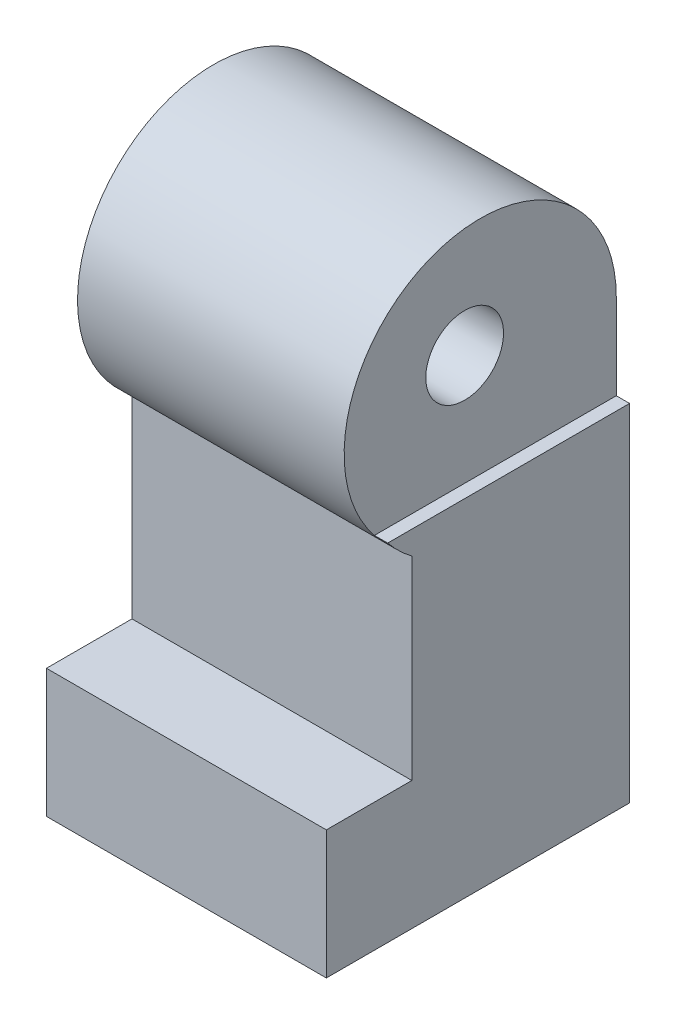
ISO-10303-21;
HEADER;
FILE_DESCRIPTION(('STEP AP214'),'2;1');
FILE_NAME('part.step','',(''),(''),'','','');
FILE_SCHEMA(('AUTOMOTIVE_DESIGN { 1 0 10303 214 1 1 1 1 }'));
ENDSEC;
DATA;
#1=APPLICATION_CONTEXT('core data for automotive mechanical design processes');
#2=APPLICATION_PROTOCOL_DEFINITION('international standard','automotive_design',2000,#1);
#3=PRODUCT_CONTEXT('',#1,'mechanical');
#4=PRODUCT('Part','Part','',(#3));
#5=PRODUCT_RELATED_PRODUCT_CATEGORY('part','',(#4));
#6=PRODUCT_DEFINITION_FORMATION('','',#4);
#7=PRODUCT_DEFINITION_CONTEXT('part definition',#1,'design');
#8=PRODUCT_DEFINITION('design','',#6,#7);
#9=PRODUCT_DEFINITION_SHAPE('','',#8);
#10=(LENGTH_UNIT() NAMED_UNIT(*) SI_UNIT(.MILLI.,.METRE.));
#11=(NAMED_UNIT(*) PLANE_ANGLE_UNIT() SI_UNIT($,.RADIAN.));
#12=(NAMED_UNIT(*) SI_UNIT($,.STERADIAN.) SOLID_ANGLE_UNIT());
#13=UNCERTAINTY_MEASURE_WITH_UNIT(LENGTH_MEASURE(1.E-05),#10,'distance_accuracy_value','');
#14=(GEOMETRIC_REPRESENTATION_CONTEXT(3) GLOBAL_UNCERTAINTY_ASSIGNED_CONTEXT((#13)) GLOBAL_UNIT_ASSIGNED_CONTEXT((#10,
#11,#12)) REPRESENTATION_CONTEXT('',''));
#15=CARTESIAN_POINT('',(0.,0.,0.));
#16=DIRECTION('',(0.,0.,1.));
#17=DIRECTION('',(1.,0.,0.));
#18=AXIS2_PLACEMENT_3D('',#15,#16,#17);
#19=CARTESIAN_POINT('',(10.8,11.4,-1.19999999999999));
#20=DIRECTION('',(-1.,0.,0.));
#21=DIRECTION('',(0.,0.,1.));
#22=AXIS2_PLACEMENT_3D('',#19,#20,#21);
#23=CYLINDRICAL_SURFACE('',#22,10.5);
#24=CARTESIAN_POINT('',(10.8,11.4,-1.19999999999999));
#25=DIRECTION('',(1.,0.,0.));
#26=DIRECTION('',(0.,0.,-1.));
#27=AXIS2_PLACEMENT_3D('',#24,#25,#26);
#28=CIRCLE('',#27,10.5);
#29=CARTESIAN_POINT('',(10.8,4.8,6.96639455328973));
#30=VERTEX_POINT('',#29);
#31=CARTESIAN_POINT('',(10.8,3.,5.10000000000001));
#32=VERTEX_POINT('',#31);
#33=EDGE_CURVE('E105',#30,#32,#28,.T.);
#34=ORIENTED_EDGE('',*,*,#33,.F.);
#35=DIRECTION('',(-1.,0.,0.));
#36=VECTOR('',#35,1.);
#37=CARTESIAN_POINT('',(10.8,4.8,6.96639455328972));
#38=LINE('',#37,#36);
#39=CARTESIAN_POINT('',(9.775,4.8,6.96639455328973));
#40=VERTEX_POINT('',#39);
#41=EDGE_CURVE('E61',#30,#40,#38,.T.);
#42=ORIENTED_EDGE('',*,*,#41,.T.);
#43=CARTESIAN_POINT('',(9.775,11.4,-1.19999999999999));
#44=DIRECTION('',(-1.,0.,0.));
#45=DIRECTION('',(0.,-1.,0.));
#46=AXIS2_PLACEMENT_3D('',#43,#44,#45);
#47=CIRCLE('',#46,10.5);
#48=CARTESIAN_POINT('',(9.775,11.4,-11.7));
#49=VERTEX_POINT('',#48);
#50=EDGE_CURVE('E149',#40,#49,#47,.T.);
#51=ORIENTED_EDGE('',*,*,#50,.T.);
#52=DIRECTION('',(-1.,0.,0.));
#53=VECTOR('',#52,1.);
#54=CARTESIAN_POINT('',(10.8,11.4,-11.7));
#55=LINE('',#54,#53);
#56=CARTESIAN_POINT('',(-10.8,11.4,-11.7));
#57=VERTEX_POINT('',#56);
#58=EDGE_CURVE('E98',#49,#57,#55,.T.);
#59=ORIENTED_EDGE('',*,*,#58,.T.);
#60=CARTESIAN_POINT('',(-10.8,11.4,-1.19999999999999));
#61=DIRECTION('',(1.,0.,0.));
#62=DIRECTION('',(0.,0.,-1.));
#63=AXIS2_PLACEMENT_3D('',#60,#61,#62);
#64=CIRCLE('',#63,10.5);
#65=CARTESIAN_POINT('',(-10.8,3.,5.10000000000001));
#66=VERTEX_POINT('',#65);
#67=EDGE_CURVE('E145',#57,#66,#64,.T.);
#68=ORIENTED_EDGE('',*,*,#67,.T.);
#69=DIRECTION('',(-1.,0.,0.));
#70=VECTOR('',#69,1.);
#71=CARTESIAN_POINT('',(10.8,3.,5.10000000000001));
#72=LINE('',#71,#70);
#73=EDGE_CURVE('E11',#32,#66,#72,.T.);
#74=ORIENTED_EDGE('',*,*,#73,.F.);
#75=EDGE_LOOP('',(#34,#42,#51,#59,#68,#74));
#76=FACE_BOUND('',#75,.T.);
#77=ADVANCED_FACE('F45',(#76),#23,.T.);
#78=CARTESIAN_POINT('',(10.8,-12.,5.10000000000001));
#79=DIRECTION('',(0.,0.,-1.));
#80=DIRECTION('',(0.,1.,0.));
#81=AXIS2_PLACEMENT_3D('',#78,#79,#80);
#82=PLANE('',#81);
#83=DIRECTION('',(0.,-1.,0.));
#84=VECTOR('',#83,1.);
#85=CARTESIAN_POINT('',(-10.8,-12.,5.10000000000001));
#86=LINE('',#85,#84);
#87=CARTESIAN_POINT('',(-10.8,-12.,5.10000000000001));
#88=VERTEX_POINT('',#87);
#89=EDGE_CURVE('E148',#66,#88,#86,.T.);
#90=ORIENTED_EDGE('',*,*,#89,.T.);
#91=DIRECTION('',(-1.,0.,0.));
#92=VECTOR('',#91,1.);
#93=CARTESIAN_POINT('',(10.8,-12.,5.10000000000001));
#94=LINE('',#93,#92);
#95=CARTESIAN_POINT('',(10.8,-12.,5.10000000000001));
#96=VERTEX_POINT('',#95);
#97=EDGE_CURVE('E54',#96,#88,#94,.T.);
#98=ORIENTED_EDGE('',*,*,#97,.F.);
#99=DIRECTION('',(0.,-1.,0.));
#100=VECTOR('',#99,1.);
#101=CARTESIAN_POINT('',(10.8,-12.,5.10000000000001));
#102=LINE('',#101,#100);
#103=EDGE_CURVE('E118',#32,#96,#102,.T.);
#104=ORIENTED_EDGE('',*,*,#103,.F.);
#105=ORIENTED_EDGE('',*,*,#73,.T.);
#106=EDGE_LOOP('',(#90,#98,#104,#105));
#107=FACE_BOUND('',#106,.T.);
#108=ADVANCED_FACE('F221',(#107),#82,.F.);
#109=CARTESIAN_POINT('',(10.8,-12.,11.7));
#110=DIRECTION('',(0.,-1.,0.));
#111=DIRECTION('',(0.,0.,-1.));
#112=AXIS2_PLACEMENT_3D('',#109,#110,#111);
#113=PLANE('',#112);
#114=DIRECTION('',(0.,0.,1.));
#115=VECTOR('',#114,1.);
#116=CARTESIAN_POINT('',(-10.8,-12.,11.7));
#117=LINE('',#116,#115);
#118=CARTESIAN_POINT('',(-10.8,-12.,11.7));
#119=VERTEX_POINT('',#118);
#120=EDGE_CURVE('E128',#88,#119,#117,.T.);
#121=ORIENTED_EDGE('',*,*,#120,.T.);
#122=DIRECTION('',(-1.,0.,0.));
#123=VECTOR('',#122,1.);
#124=CARTESIAN_POINT('',(10.8,-12.,11.7));
#125=LINE('',#124,#123);
#126=CARTESIAN_POINT('',(10.8,-12.,11.7));
#127=VERTEX_POINT('',#126);
#128=EDGE_CURVE('E125',#127,#119,#125,.T.);
#129=ORIENTED_EDGE('',*,*,#128,.F.);
#130=DIRECTION('',(0.,0.,1.));
#131=VECTOR('',#130,1.);
#132=CARTESIAN_POINT('',(10.8,-12.,11.7));
#133=LINE('',#132,#131);
#134=EDGE_CURVE('E112',#96,#127,#133,.T.);
#135=ORIENTED_EDGE('',*,*,#134,.F.);
#136=ORIENTED_EDGE('',*,*,#97,.T.);
#137=EDGE_LOOP('',(#121,#129,#135,#136));
#138=FACE_BOUND('',#137,.T.);
#139=ADVANCED_FACE('F126',(#138),#113,.F.);
#140=CARTESIAN_POINT('',(10.8,-21.9,11.7));
#141=DIRECTION('',(0.,0.,-1.));
#142=DIRECTION('',(-1.,0.,0.));
#143=AXIS2_PLACEMENT_3D('',#140,#141,#142);
#144=PLANE('',#143);
#145=DIRECTION('',(0.,-1.,0.));
#146=VECTOR('',#145,1.);
#147=CARTESIAN_POINT('',(-10.8,-21.9,11.7));
#148=LINE('',#147,#146);
#149=CARTESIAN_POINT('',(-10.8,-21.9,11.7));
#150=VERTEX_POINT('',#149);
#151=EDGE_CURVE('E154',#119,#150,#148,.T.);
#152=ORIENTED_EDGE('',*,*,#151,.T.);
#153=DIRECTION('',(-1.,0.,0.));
#154=VECTOR('',#153,1.);
#155=CARTESIAN_POINT('',(10.8,-21.9,11.7));
#156=LINE('',#155,#154);
#157=CARTESIAN_POINT('',(10.8,-21.9,11.7));
#158=VERTEX_POINT('',#157);
#159=EDGE_CURVE('E132',#158,#150,#156,.T.);
#160=ORIENTED_EDGE('',*,*,#159,.F.);
#161=DIRECTION('',(0.,-1.,0.));
#162=VECTOR('',#161,1.);
#163=CARTESIAN_POINT('',(10.8,-21.9,11.7));
#164=LINE('',#163,#162);
#165=EDGE_CURVE('E116',#127,#158,#164,.T.);
#166=ORIENTED_EDGE('',*,*,#165,.F.);
#167=ORIENTED_EDGE('',*,*,#128,.T.);
#168=EDGE_LOOP('',(#152,#160,#166,#167));
#169=FACE_BOUND('',#168,.T.);
#170=ADVANCED_FACE('F134',(#169),#144,.F.);
#171=CARTESIAN_POINT('',(10.8,-21.9,-11.7));
#172=DIRECTION('',(0.,1.,0.));
#173=DIRECTION('',(0.,0.,1.));
#174=AXIS2_PLACEMENT_3D('',#171,#172,#173);
#175=PLANE('',#174);
#176=DIRECTION('',(0.,0.,-1.));
#177=VECTOR('',#176,1.);
#178=CARTESIAN_POINT('',(-10.8,-21.9,-11.7));
#179=LINE('',#178,#177);
#180=CARTESIAN_POINT('',(-10.8,-21.9,-11.7));
#181=VERTEX_POINT('',#180);
#182=EDGE_CURVE('E157',#150,#181,#179,.T.);
#183=ORIENTED_EDGE('',*,*,#182,.T.);
#184=DIRECTION('',(-1.,0.,0.));
#185=VECTOR('',#184,1.);
#186=CARTESIAN_POINT('',(10.8,-21.9,-11.7));
#187=LINE('',#186,#185);
#188=CARTESIAN_POINT('',(10.8,-21.9,-11.7));
#189=VERTEX_POINT('',#188);
#190=EDGE_CURVE('E165',#189,#181,#187,.T.);
#191=ORIENTED_EDGE('',*,*,#190,.F.);
#192=DIRECTION('',(0.,0.,-1.));
#193=VECTOR('',#192,1.);
#194=CARTESIAN_POINT('',(10.8,-21.9,-11.7));
#195=LINE('',#194,#193);
#196=EDGE_CURVE('E70',#158,#189,#195,.T.);
#197=ORIENTED_EDGE('',*,*,#196,.F.);
#198=ORIENTED_EDGE('',*,*,#159,.T.);
#199=EDGE_LOOP('',(#183,#191,#197,#198));
#200=FACE_BOUND('',#199,.T.);
#201=ADVANCED_FACE('F179',(#200),#175,.F.);
#202=CARTESIAN_POINT('',(10.8,11.4,-11.7));
#203=DIRECTION('',(0.,0.,1.));
#204=DIRECTION('',(0.,-1.,0.));
#205=AXIS2_PLACEMENT_3D('',#202,#203,#204);
#206=PLANE('',#205);
#207=DIRECTION('',(0.,-1.,0.));
#208=VECTOR('',#207,1.);
#209=CARTESIAN_POINT('',(9.775,21.9,-11.7));
#210=LINE('',#209,#208);
#211=CARTESIAN_POINT('',(9.775,4.8,-11.7));
#212=VERTEX_POINT('',#211);
#213=EDGE_CURVE('E199',#49,#212,#210,.T.);
#214=ORIENTED_EDGE('',*,*,#213,.T.);
#215=DIRECTION('',(1.,0.,0.));
#216=VECTOR('',#215,1.);
#217=CARTESIAN_POINT('',(10.8,4.8,-11.7));
#218=LINE('',#217,#216);
#219=CARTESIAN_POINT('',(10.8,4.8,-11.7));
#220=VERTEX_POINT('',#219);
#221=EDGE_CURVE('E187',#212,#220,#218,.T.);
#222=ORIENTED_EDGE('',*,*,#221,.T.);
#223=DIRECTION('',(0.,1.,0.));
#224=VECTOR('',#223,1.);
#225=CARTESIAN_POINT('',(10.8,11.4,-11.7));
#226=LINE('',#225,#224);
#227=EDGE_CURVE('E139',#189,#220,#226,.T.);
#228=ORIENTED_EDGE('',*,*,#227,.F.);
#229=ORIENTED_EDGE('',*,*,#190,.T.);
#230=DIRECTION('',(0.,1.,0.));
#231=VECTOR('',#230,1.);
#232=CARTESIAN_POINT('',(-10.8,11.4,-11.7));
#233=LINE('',#232,#231);
#234=EDGE_CURVE('E160',#181,#57,#233,.T.);
#235=ORIENTED_EDGE('',*,*,#234,.T.);
#236=ORIENTED_EDGE('',*,*,#58,.F.);
#237=EDGE_LOOP('',(#214,#222,#228,#229,#235,#236));
#238=FACE_BOUND('',#237,.T.);
#239=ADVANCED_FACE('F184',(#238),#206,.F.);
#240=CARTESIAN_POINT('',(10.8,11.4,-1.19999999999999));
#241=DIRECTION('',(1.,0.,0.));
#242=DIRECTION('',(0.,0.,-1.));
#243=AXIS2_PLACEMENT_3D('',#240,#241,#242);
#244=PLANE('',#243);
#245=DIRECTION('',(0.,0.,1.));
#246=VECTOR('',#245,1.);
#247=CARTESIAN_POINT('',(10.8,4.8,-11.7));
#248=LINE('',#247,#246);
#249=EDGE_CURVE('E188',#220,#30,#248,.T.);
#250=ORIENTED_EDGE('',*,*,#249,.T.);
#251=ORIENTED_EDGE('',*,*,#33,.T.);
#252=ORIENTED_EDGE('',*,*,#103,.T.);
#253=ORIENTED_EDGE('',*,*,#134,.T.);
#254=ORIENTED_EDGE('',*,*,#165,.T.);
#255=ORIENTED_EDGE('',*,*,#196,.T.);
#256=ORIENTED_EDGE('',*,*,#227,.T.);
#257=EDGE_LOOP('',(#250,#251,#252,#253,#254,#255,#256));
#258=FACE_BOUND('',#257,.T.);
#259=ADVANCED_FACE('F114',(#258),#244,.T.);
#260=CARTESIAN_POINT('',(-10.8,11.4,-1.19999999999999));
#261=DIRECTION('',(1.,0.,0.));
#262=DIRECTION('',(0.,0.,-1.));
#263=AXIS2_PLACEMENT_3D('',#260,#261,#262);
#264=PLANE('',#263);
#265=ORIENTED_EDGE('',*,*,#67,.F.);
#266=ORIENTED_EDGE('',*,*,#234,.F.);
#267=ORIENTED_EDGE('',*,*,#182,.F.);
#268=ORIENTED_EDGE('',*,*,#151,.F.);
#269=ORIENTED_EDGE('',*,*,#120,.F.);
#270=ORIENTED_EDGE('',*,*,#89,.F.);
#271=EDGE_LOOP('',(#265,#266,#267,#268,#269,#270));
#272=FACE_BOUND('',#271,.T.);
#273=ADVANCED_FACE('F175',(#272),#264,.F.);
#274=CARTESIAN_POINT('',(9.775,21.9,-11.7));
#275=DIRECTION('',(-1.,0.,0.));
#276=DIRECTION('',(0.,-1.,0.));
#277=AXIS2_PLACEMENT_3D('',#274,#275,#276);
#278=PLANE('',#277);
#279=CARTESIAN_POINT('',(9.775,13.35,0.));
#280=DIRECTION('',(-1.,0.,0.));
#281=DIRECTION('',(0.,-1.,0.));
#282=AXIS2_PLACEMENT_3D('',#279,#280,#281);
#283=CIRCLE('',#282,3.);
#284=CARTESIAN_POINT('',(9.775,10.35,0.));
#285=VERTEX_POINT('',#284);
#286=EDGE_CURVE('E48',#285,#285,#283,.F.);
#287=ORIENTED_EDGE('',*,*,#286,.F.);
#288=EDGE_LOOP('',(#287));
#289=FACE_BOUND('',#288,.T.);
#290=DIRECTION('',(0.,0.,1.));
#291=VECTOR('',#290,1.);
#292=CARTESIAN_POINT('',(9.775,4.8,-11.7));
#293=LINE('',#292,#291);
#294=EDGE_CURVE('E197',#212,#40,#293,.T.);
#295=ORIENTED_EDGE('',*,*,#294,.F.);
#296=ORIENTED_EDGE('',*,*,#213,.F.);
#297=ORIENTED_EDGE('',*,*,#50,.F.);
#298=EDGE_LOOP('',(#295,#296,#297));
#299=FACE_BOUND('',#298,.T.);
#300=ADVANCED_FACE('F198',(#289,#299),#278,.F.);
#301=CARTESIAN_POINT('',(10.8,4.8,-11.7));
#302=DIRECTION('',(0.,-1.,0.));
#303=DIRECTION('',(0.,0.,-1.));
#304=AXIS2_PLACEMENT_3D('',#301,#302,#303);
#305=PLANE('',#304);
#306=ORIENTED_EDGE('',*,*,#249,.F.);
#307=ORIENTED_EDGE('',*,*,#221,.F.);
#308=ORIENTED_EDGE('',*,*,#294,.T.);
#309=ORIENTED_EDGE('',*,*,#41,.F.);
#310=EDGE_LOOP('',(#306,#307,#308,#309));
#311=FACE_BOUND('',#310,.T.);
#312=ADVANCED_FACE('F202',(#311),#305,.F.);
#313=CARTESIAN_POINT('',(10.8,13.35,0.));
#314=DIRECTION('',(-1.,0.,0.));
#315=DIRECTION('',(0.,-1.,0.));
#316=AXIS2_PLACEMENT_3D('',#313,#314,#315);
#317=CYLINDRICAL_SURFACE('',#316,3.);
#318=CARTESIAN_POINT('',(3.35,13.35,0.));
#319=DIRECTION('',(1.,0.,0.));
#320=DIRECTION('',(0.,1.,0.));
#321=AXIS2_PLACEMENT_3D('',#318,#319,#320);
#322=CIRCLE('',#321,3.);
#323=CARTESIAN_POINT('',(3.35,16.35,0.));
#324=VERTEX_POINT('',#323);
#325=EDGE_CURVE('E209',#324,#324,#322,.T.);
#326=ORIENTED_EDGE('',*,*,#325,.F.);
#327=EDGE_LOOP('',(#326));
#328=FACE_BOUND('',#327,.T.);
#329=ORIENTED_EDGE('',*,*,#286,.T.);
#330=EDGE_LOOP('',(#329));
#331=FACE_BOUND('',#330,.T.);
#332=ADVANCED_FACE('F244',(#328,#331),#317,.F.);
#333=CARTESIAN_POINT('',(3.35,13.35,0.));
#334=DIRECTION('',(1.,0.,0.));
#335=DIRECTION('',(0.,1.,0.));
#336=AXIS2_PLACEMENT_3D('',#333,#334,#335);
#337=PLANE('',#336);
#338=ORIENTED_EDGE('',*,*,#325,.T.);
#339=EDGE_LOOP('',(#338));
#340=FACE_BOUND('',#339,.T.);
#341=ADVANCED_FACE('F247',(#340),#337,.T.);
#342=CLOSED_SHELL('',(#77,#108,#139,#170,#201,#239,#259,#273,#300,#312,#332,#341));
#343=MANIFOLD_SOLID_BREP('B2',#342);
#344=ADVANCED_BREP_SHAPE_REPRESENTATION('',(#18,#343),#14);
#345=SHAPE_DEFINITION_REPRESENTATION(#9,#344);
ENDSEC;
END-ISO-10303-21;
